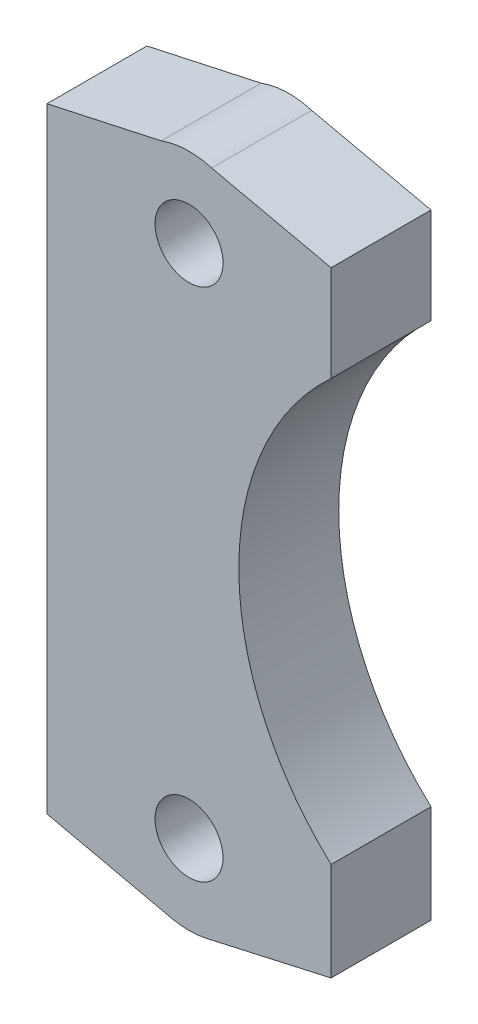
ISO-10303-21;
HEADER;
FILE_DESCRIPTION(('STEP AP214'),'2;1');
FILE_NAME('part.step','',(''),(''),'','','');
FILE_SCHEMA(('AUTOMOTIVE_DESIGN { 1 0 10303 214 1 1 1 1 }'));
ENDSEC;
DATA;
#1=APPLICATION_CONTEXT('core data for automotive mechanical design processes');
#2=APPLICATION_PROTOCOL_DEFINITION('international standard','automotive_design',2000,#1);
#3=PRODUCT_CONTEXT('',#1,'mechanical');
#4=PRODUCT('Part','Part','',(#3));
#5=PRODUCT_RELATED_PRODUCT_CATEGORY('part','',(#4));
#6=PRODUCT_DEFINITION_FORMATION('','',#4);
#7=PRODUCT_DEFINITION_CONTEXT('part definition',#1,'design');
#8=PRODUCT_DEFINITION('design','',#6,#7);
#9=PRODUCT_DEFINITION_SHAPE('','',#8);
#10=(LENGTH_UNIT() NAMED_UNIT(*) SI_UNIT(.MILLI.,.METRE.));
#11=(NAMED_UNIT(*) PLANE_ANGLE_UNIT() SI_UNIT($,.RADIAN.));
#12=(NAMED_UNIT(*) SI_UNIT($,.STERADIAN.) SOLID_ANGLE_UNIT());
#13=UNCERTAINTY_MEASURE_WITH_UNIT(LENGTH_MEASURE(1.E-05),#10,'distance_accuracy_value','');
#14=(GEOMETRIC_REPRESENTATION_CONTEXT(3) GLOBAL_UNCERTAINTY_ASSIGNED_CONTEXT((#13)) GLOBAL_UNIT_ASSIGNED_CONTEXT((#10,
#11,#12)) REPRESENTATION_CONTEXT('',''));
#15=CARTESIAN_POINT('',(0.,0.,0.));
#16=DIRECTION('',(0.,0.,1.));
#17=DIRECTION('',(1.,0.,0.));
#18=AXIS2_PLACEMENT_3D('',#15,#16,#17);
#19=CARTESIAN_POINT('',(27.6922594459164,-12.88997055683,5.0222745073035));
#20=DIRECTION('',(0.,0.,1.));
#21=DIRECTION('',(1.,0.,0.));
#22=AXIS2_PLACEMENT_3D('',#19,#20,#21);
#23=PLANE('',#22);
#24=CARTESIAN_POINT('',(27.6922594459164,-12.88997055683,5.0222745073035));
#25=DIRECTION('',(0.,0.,1.));
#26=DIRECTION('',(1.,0.,0.));
#27=AXIS2_PLACEMENT_3D('',#24,#25,#26);
#28=CIRCLE('',#27,1.7000000000002);
#29=CARTESIAN_POINT('',(29.3922594459166,-12.88997055683,5.0222745073035));
#30=VERTEX_POINT('',#29);
#31=EDGE_CURVE('E149',#30,#30,#28,.T.);
#32=ORIENTED_EDGE('',*,*,#31,.F.);
#33=EDGE_LOOP('',(#32));
#34=FACE_BOUND('',#33,.T.);
#35=CARTESIAN_POINT('',(27.6922594459164,-12.88997055683,5.0222745073035));
#36=DIRECTION('',(0.,0.,1.));
#37=DIRECTION('',(1.,0.,0.));
#38=AXIS2_PLACEMENT_3D('',#35,#36,#37);
#39=CIRCLE('',#38,3.99740349553943);
#40=CARTESIAN_POINT('',(26.8158530155752,-16.7901175380356,5.0222745073035));
#41=VERTEX_POINT('',#40);
#42=CARTESIAN_POINT('',(28.5686658762576,-16.7901175380356,5.0222745073035));
#43=VERTEX_POINT('',#42);
#44=EDGE_CURVE('E164',#41,#43,#39,.T.);
#45=ORIENTED_EDGE('',*,*,#44,.T.);
#46=DIRECTION('',(0.975670078228955,0.219243924542289,0.));
#47=VECTOR('',#46,1.);
#48=CARTESIAN_POINT('',(34.7995409964517,-15.3899705568307,5.0222745073035));
#49=LINE('',#48,#47);
#50=CARTESIAN_POINT('',(34.7995409964517,-15.3899705568307,5.0222745073035));
#51=VERTEX_POINT('',#50);
#52=EDGE_CURVE('E102',#43,#51,#49,.T.);
#53=ORIENTED_EDGE('',*,*,#52,.T.);
#54=DIRECTION('',(0.,1.,0.));
#55=VECTOR('',#54,1.);
#56=CARTESIAN_POINT('',(34.7995409964517,-15.3899705568307,5.0222745073035));
#57=LINE('',#56,#55);
#58=CARTESIAN_POINT('',(34.7995409964517,-10.4696394724291,5.0222745073035));
#59=VERTEX_POINT('',#58);
#60=EDGE_CURVE('E185',#51,#59,#57,.T.);
#61=ORIENTED_EDGE('',*,*,#60,.T.);
#62=CARTESIAN_POINT('',(44.4999999999989,0.0600294431714931,5.0222745073035));
#63=DIRECTION('',(0.,0.,-1.));
#64=DIRECTION('',(1.,0.,0.));
#65=AXIS2_PLACEMENT_3D('',#62,#63,#64);
#66=CIRCLE('',#65,14.3168722964084);
#67=CARTESIAN_POINT('',(34.7995409964517,10.5896983587721,5.0222745073035));
#68=VERTEX_POINT('',#67);
#69=EDGE_CURVE('E204',#59,#68,#66,.T.);
#70=ORIENTED_EDGE('',*,*,#69,.T.);
#71=DIRECTION('',(0.,1.,0.));
#72=VECTOR('',#71,1.);
#73=CARTESIAN_POINT('',(34.7995409964517,10.5896983587721,5.0222745073035));
#74=LINE('',#73,#72);
#75=CARTESIAN_POINT('',(34.7995409964517,15.3899705568256,5.0222745073035));
#76=VERTEX_POINT('',#75);
#77=EDGE_CURVE('E201',#68,#76,#74,.T.);
#78=ORIENTED_EDGE('',*,*,#77,.T.);
#79=DIRECTION('',(-0.975993027428264,0.217801768614059,0.));
#80=VECTOR('',#79,1.);
#81=CARTESIAN_POINT('',(34.7995409964517,15.3899705568256,5.0222745073035));
#82=LINE('',#81,#80);
#83=CARTESIAN_POINT('',(28.8288452214682,16.7223859154419,5.0222745073035));
#84=VERTEX_POINT('',#83);
#85=EDGE_CURVE('E203',#76,#84,#82,.T.);
#86=ORIENTED_EDGE('',*,*,#85,.T.);
#87=CARTESIAN_POINT('',(27.6922594459164,12.8899705568263,5.0222745073035));
#88=DIRECTION('',(0.,0.,1.));
#89=DIRECTION('',(1.,0.,0.));
#90=AXIS2_PLACEMENT_3D('',#87,#88,#89);
#91=CIRCLE('',#90,3.99740349553804);
#92=CARTESIAN_POINT('',(26.2984276536664,16.6364979677834,5.0222745073035));
#93=VERTEX_POINT('',#92);
#94=EDGE_CURVE('E127',#84,#93,#91,.T.);
#95=ORIENTED_EDGE('',*,*,#94,.T.);
#96=DIRECTION('',(-0.977017308665612,-0.213159983504887,0.));
#97=VECTOR('',#96,1.);
#98=CARTESIAN_POINT('',(20.584977895382,15.3899705568256,5.0222745073035));
#99=LINE('',#98,#97);
#100=CARTESIAN_POINT('',(20.584977895382,15.3899705568256,5.0222745073035));
#101=VERTEX_POINT('',#100);
#102=EDGE_CURVE('E121',#93,#101,#99,.T.);
#103=ORIENTED_EDGE('',*,*,#102,.T.);
#104=DIRECTION('',(0.,-1.,0.));
#105=VECTOR('',#104,1.);
#106=CARTESIAN_POINT('',(20.584977895382,-15.3899705568307,5.0222745073035));
#107=LINE('',#106,#105);
#108=CARTESIAN_POINT('',(20.584977895382,-15.3899705568307,5.0222745073035));
#109=VERTEX_POINT('',#108);
#110=EDGE_CURVE('E125',#101,#109,#107,.T.);
#111=ORIENTED_EDGE('',*,*,#110,.T.);
#112=DIRECTION('',(0.975670078228948,-0.219243924542318,0.));
#113=VECTOR('',#112,1.);
#114=CARTESIAN_POINT('',(26.8158530155752,-16.7901175380356,5.0222745073035));
#115=LINE('',#114,#113);
#116=EDGE_CURVE('E53',#109,#41,#115,.T.);
#117=ORIENTED_EDGE('',*,*,#116,.T.);
#118=EDGE_LOOP('',(#45,#53,#61,#70,#78,#86,#95,#103,#111,#117));
#119=FACE_BOUND('',#118,.T.);
#120=CARTESIAN_POINT('',(27.6922594459164,12.8899705568263,5.0222745073035));
#121=DIRECTION('',(0.,0.,1.));
#122=DIRECTION('',(1.,0.,0.));
#123=AXIS2_PLACEMENT_3D('',#120,#121,#122);
#124=CIRCLE('',#123,1.7000000000002);
#125=CARTESIAN_POINT('',(29.3922594459166,12.8899705568263,5.0222745073035));
#126=VERTEX_POINT('',#125);
#127=EDGE_CURVE('E215',#126,#126,#124,.T.);
#128=ORIENTED_EDGE('',*,*,#127,.F.);
#129=EDGE_LOOP('',(#128));
#130=FACE_BOUND('',#129,.T.);
#131=ADVANCED_FACE('F36',(#34,#119,#130),#23,.T.);
#132=CARTESIAN_POINT('',(27.6922594459164,-12.88997055683,0.0222745073034983));
#133=DIRECTION('',(0.,0.,1.));
#134=DIRECTION('',(1.,0.,0.));
#135=AXIS2_PLACEMENT_3D('',#132,#133,#134);
#136=PLANE('',#135);
#137=CARTESIAN_POINT('',(27.6922594459164,-12.88997055683,0.0222745073034983));
#138=DIRECTION('',(0.,0.,1.));
#139=DIRECTION('',(1.,0.,0.));
#140=AXIS2_PLACEMENT_3D('',#137,#138,#139);
#141=CIRCLE('',#140,3.99740349553943);
#142=CARTESIAN_POINT('',(26.8158530155752,-16.7901175380356,0.0222745073034983));
#143=VERTEX_POINT('',#142);
#144=CARTESIAN_POINT('',(28.5686658762576,-16.7901175380356,0.0222745073034983));
#145=VERTEX_POINT('',#144);
#146=EDGE_CURVE('E145',#143,#145,#141,.T.);
#147=ORIENTED_EDGE('',*,*,#146,.F.);
#148=DIRECTION('',(0.975670078228948,-0.219243924542318,0.));
#149=VECTOR('',#148,1.);
#150=CARTESIAN_POINT('',(26.8158530155752,-16.7901175380356,0.0222745073034983));
#151=LINE('',#150,#149);
#152=CARTESIAN_POINT('',(20.584977895382,-15.3899705568307,0.0222745073034983));
#153=VERTEX_POINT('',#152);
#154=EDGE_CURVE('E94',#153,#143,#151,.T.);
#155=ORIENTED_EDGE('',*,*,#154,.F.);
#156=DIRECTION('',(0.,-1.,0.));
#157=VECTOR('',#156,1.);
#158=CARTESIAN_POINT('',(20.584977895382,-15.3899705568307,0.0222745073034983));
#159=LINE('',#158,#157);
#160=CARTESIAN_POINT('',(20.584977895382,15.3899705568256,0.0222745073034983));
#161=VERTEX_POINT('',#160);
#162=EDGE_CURVE('E88',#161,#153,#159,.T.);
#163=ORIENTED_EDGE('',*,*,#162,.F.);
#164=DIRECTION('',(-0.977017308665612,-0.213159983504887,0.));
#165=VECTOR('',#164,1.);
#166=CARTESIAN_POINT('',(20.584977895382,15.3899705568256,0.0222745073034983));
#167=LINE('',#166,#165);
#168=CARTESIAN_POINT('',(26.2984276536664,16.6364979677834,0.0222745073034983));
#169=VERTEX_POINT('',#168);
#170=EDGE_CURVE('E135',#169,#161,#167,.T.);
#171=ORIENTED_EDGE('',*,*,#170,.F.);
#172=CARTESIAN_POINT('',(27.6922594459164,12.8899705568263,0.0222745073034983));
#173=DIRECTION('',(0.,0.,1.));
#174=DIRECTION('',(1.,0.,0.));
#175=AXIS2_PLACEMENT_3D('',#172,#173,#174);
#176=CIRCLE('',#175,3.99740349553804);
#177=CARTESIAN_POINT('',(28.8288452214682,16.7223859154419,0.0222745073034983));
#178=VERTEX_POINT('',#177);
#179=EDGE_CURVE('E159',#178,#169,#176,.T.);
#180=ORIENTED_EDGE('',*,*,#179,.F.);
#181=DIRECTION('',(-0.975993027428264,0.217801768614059,0.));
#182=VECTOR('',#181,1.);
#183=CARTESIAN_POINT('',(34.7995409964517,15.3899705568256,0.0222745073034983));
#184=LINE('',#183,#182);
#185=CARTESIAN_POINT('',(34.7995409964517,15.3899705568256,0.0222745073034983));
#186=VERTEX_POINT('',#185);
#187=EDGE_CURVE('E157',#186,#178,#184,.T.);
#188=ORIENTED_EDGE('',*,*,#187,.F.);
#189=DIRECTION('',(0.,1.,0.));
#190=VECTOR('',#189,1.);
#191=CARTESIAN_POINT('',(34.7995409964517,10.5896983587721,0.0222745073034983));
#192=LINE('',#191,#190);
#193=CARTESIAN_POINT('',(34.7995409964517,10.5896983587721,0.0222745073034983));
#194=VERTEX_POINT('',#193);
#195=EDGE_CURVE('E155',#194,#186,#192,.T.);
#196=ORIENTED_EDGE('',*,*,#195,.F.);
#197=CARTESIAN_POINT('',(44.4999999999989,0.0600294431714931,0.0222745073034983));
#198=DIRECTION('',(0.,0.,-1.));
#199=DIRECTION('',(1.,0.,0.));
#200=AXIS2_PLACEMENT_3D('',#197,#198,#199);
#201=CIRCLE('',#200,14.3168722964084);
#202=CARTESIAN_POINT('',(34.7995409964517,-10.4696394724291,0.0222745073034983));
#203=VERTEX_POINT('',#202);
#204=EDGE_CURVE('E153',#203,#194,#201,.T.);
#205=ORIENTED_EDGE('',*,*,#204,.F.);
#206=DIRECTION('',(0.,1.,0.));
#207=VECTOR('',#206,1.);
#208=CARTESIAN_POINT('',(34.7995409964517,-15.3899705568307,0.0222745073034983));
#209=LINE('',#208,#207);
#210=CARTESIAN_POINT('',(34.7995409964517,-15.3899705568307,0.0222745073034983));
#211=VERTEX_POINT('',#210);
#212=EDGE_CURVE('E151',#211,#203,#209,.T.);
#213=ORIENTED_EDGE('',*,*,#212,.F.);
#214=DIRECTION('',(0.975670078228955,0.219243924542289,0.));
#215=VECTOR('',#214,1.);
#216=CARTESIAN_POINT('',(34.7995409964517,-15.3899705568307,0.0222745073034983));
#217=LINE('',#216,#215);
#218=EDGE_CURVE('E148',#145,#211,#217,.T.);
#219=ORIENTED_EDGE('',*,*,#218,.F.);
#220=EDGE_LOOP('',(#147,#155,#163,#171,#180,#188,#196,#205,#213,#219));
#221=FACE_BOUND('',#220,.T.);
#222=CARTESIAN_POINT('',(27.6922594459164,-12.88997055683,0.0222745073034983));
#223=DIRECTION('',(0.,0.,1.));
#224=DIRECTION('',(1.,0.,0.));
#225=AXIS2_PLACEMENT_3D('',#222,#223,#224);
#226=CIRCLE('',#225,1.7000000000002);
#227=CARTESIAN_POINT('',(29.3922594459166,-12.88997055683,0.0222745073034983));
#228=VERTEX_POINT('',#227);
#229=EDGE_CURVE('E212',#228,#228,#226,.T.);
#230=ORIENTED_EDGE('',*,*,#229,.T.);
#231=EDGE_LOOP('',(#230));
#232=FACE_BOUND('',#231,.T.);
#233=CARTESIAN_POINT('',(27.6922594459164,12.8899705568263,0.0222745073034983));
#234=DIRECTION('',(0.,0.,1.));
#235=DIRECTION('',(1.,0.,0.));
#236=AXIS2_PLACEMENT_3D('',#233,#234,#235);
#237=CIRCLE('',#236,1.7000000000002);
#238=CARTESIAN_POINT('',(29.3922594459166,12.8899705568263,0.0222745073034983));
#239=VERTEX_POINT('',#238);
#240=EDGE_CURVE('E218',#239,#239,#237,.T.);
#241=ORIENTED_EDGE('',*,*,#240,.T.);
#242=EDGE_LOOP('',(#241));
#243=FACE_BOUND('',#242,.T.);
#244=ADVANCED_FACE('F189',(#221,#232,#243),#136,.F.);
#245=CARTESIAN_POINT('',(27.6922594459164,-12.88997055683,5.0222745073035));
#246=DIRECTION('',(0.,0.,-1.));
#247=DIRECTION('',(-1.,0.,0.));
#248=AXIS2_PLACEMENT_3D('',#245,#246,#247);
#249=CYLINDRICAL_SURFACE('',#248,3.99740349553943);
#250=ORIENTED_EDGE('',*,*,#146,.T.);
#251=DIRECTION('',(0.,0.,-1.));
#252=VECTOR('',#251,1.);
#253=CARTESIAN_POINT('',(28.5686658762576,-16.7901175380356,5.0222745073035));
#254=LINE('',#253,#252);
#255=EDGE_CURVE('E11',#43,#145,#254,.T.);
#256=ORIENTED_EDGE('',*,*,#255,.F.);
#257=ORIENTED_EDGE('',*,*,#44,.F.);
#258=DIRECTION('',(0.,0.,-1.));
#259=VECTOR('',#258,1.);
#260=CARTESIAN_POINT('',(26.8158530155752,-16.7901175380356,5.0222745073035));
#261=LINE('',#260,#259);
#262=EDGE_CURVE('E141',#41,#143,#261,.T.);
#263=ORIENTED_EDGE('',*,*,#262,.T.);
#264=EDGE_LOOP('',(#250,#256,#257,#263));
#265=FACE_BOUND('',#264,.T.);
#266=ADVANCED_FACE('F38',(#265),#249,.T.);
#267=CARTESIAN_POINT('',(34.7995409964517,-15.3899705568307,5.0222745073035));
#268=DIRECTION('',(-0.219243924542289,0.975670078228955,0.));
#269=DIRECTION('',(-0.975670078228955,-0.219243924542289,0.));
#270=AXIS2_PLACEMENT_3D('',#267,#268,#269);
#271=PLANE('',#270);
#272=ORIENTED_EDGE('',*,*,#218,.T.);
#273=DIRECTION('',(0.,0.,-1.));
#274=VECTOR('',#273,1.);
#275=CARTESIAN_POINT('',(34.7995409964517,-15.3899705568307,5.0222745073035));
#276=LINE('',#275,#274);
#277=EDGE_CURVE('E45',#51,#211,#276,.T.);
#278=ORIENTED_EDGE('',*,*,#277,.F.);
#279=ORIENTED_EDGE('',*,*,#52,.F.);
#280=ORIENTED_EDGE('',*,*,#255,.T.);
#281=EDGE_LOOP('',(#272,#278,#279,#280));
#282=FACE_BOUND('',#281,.T.);
#283=ADVANCED_FACE('F258',(#282),#271,.F.);
#284=CARTESIAN_POINT('',(34.7995409964517,-15.3899705568307,5.0222745073035));
#285=DIRECTION('',(-1.,0.,0.));
#286=DIRECTION('',(0.,-1.,0.));
#287=AXIS2_PLACEMENT_3D('',#284,#285,#286);
#288=PLANE('',#287);
#289=ORIENTED_EDGE('',*,*,#212,.T.);
#290=DIRECTION('',(0.,0.,-1.));
#291=VECTOR('',#290,1.);
#292=CARTESIAN_POINT('',(34.7995409964517,-10.4696394724291,5.0222745073035));
#293=LINE('',#292,#291);
#294=EDGE_CURVE('E177',#59,#203,#293,.T.);
#295=ORIENTED_EDGE('',*,*,#294,.F.);
#296=ORIENTED_EDGE('',*,*,#60,.F.);
#297=ORIENTED_EDGE('',*,*,#277,.T.);
#298=EDGE_LOOP('',(#289,#295,#296,#297));
#299=FACE_BOUND('',#298,.T.);
#300=ADVANCED_FACE('F183',(#299),#288,.F.);
#301=CARTESIAN_POINT('',(44.4999999999989,0.0600294431714931,5.0222745073035));
#302=DIRECTION('',(0.,0.,-1.));
#303=DIRECTION('',(-1.,0.,0.));
#304=AXIS2_PLACEMENT_3D('',#301,#302,#303);
#305=CYLINDRICAL_SURFACE('',#304,14.3168722964084);
#306=ORIENTED_EDGE('',*,*,#204,.T.);
#307=DIRECTION('',(0.,0.,-1.));
#308=VECTOR('',#307,1.);
#309=CARTESIAN_POINT('',(34.7995409964517,10.5896983587721,5.0222745073035));
#310=LINE('',#309,#308);
#311=EDGE_CURVE('E174',#68,#194,#310,.T.);
#312=ORIENTED_EDGE('',*,*,#311,.F.);
#313=ORIENTED_EDGE('',*,*,#69,.F.);
#314=ORIENTED_EDGE('',*,*,#294,.T.);
#315=EDGE_LOOP('',(#306,#312,#313,#314));
#316=FACE_BOUND('',#315,.T.);
#317=ADVANCED_FACE('F195',(#316),#305,.F.);
#318=CARTESIAN_POINT('',(34.7995409964517,10.5896983587721,5.0222745073035));
#319=DIRECTION('',(-1.,0.,0.));
#320=DIRECTION('',(0.,-1.,0.));
#321=AXIS2_PLACEMENT_3D('',#318,#319,#320);
#322=PLANE('',#321);
#323=ORIENTED_EDGE('',*,*,#195,.T.);
#324=DIRECTION('',(0.,0.,-1.));
#325=VECTOR('',#324,1.);
#326=CARTESIAN_POINT('',(34.7995409964517,15.3899705568256,5.0222745073035));
#327=LINE('',#326,#325);
#328=EDGE_CURVE('E171',#76,#186,#327,.T.);
#329=ORIENTED_EDGE('',*,*,#328,.F.);
#330=ORIENTED_EDGE('',*,*,#77,.F.);
#331=ORIENTED_EDGE('',*,*,#311,.T.);
#332=EDGE_LOOP('',(#323,#329,#330,#331));
#333=FACE_BOUND('',#332,.T.);
#334=ADVANCED_FACE('F199',(#333),#322,.F.);
#335=CARTESIAN_POINT('',(34.7995409964517,15.3899705568256,5.0222745073035));
#336=DIRECTION('',(-0.217801768614059,-0.975993027428264,0.));
#337=DIRECTION('',(0.975993027428264,-0.21780176861406,0.));
#338=AXIS2_PLACEMENT_3D('',#335,#336,#337);
#339=PLANE('',#338);
#340=ORIENTED_EDGE('',*,*,#187,.T.);
#341=DIRECTION('',(0.,0.,-1.));
#342=VECTOR('',#341,1.);
#343=CARTESIAN_POINT('',(28.8288452214682,16.7223859154419,5.0222745073035));
#344=LINE('',#343,#342);
#345=EDGE_CURVE('E168',#84,#178,#344,.T.);
#346=ORIENTED_EDGE('',*,*,#345,.F.);
#347=ORIENTED_EDGE('',*,*,#85,.F.);
#348=ORIENTED_EDGE('',*,*,#328,.T.);
#349=EDGE_LOOP('',(#340,#346,#347,#348));
#350=FACE_BOUND('',#349,.T.);
#351=ADVANCED_FACE('F248',(#350),#339,.F.);
#352=CARTESIAN_POINT('',(27.6922594459164,12.8899705568263,5.0222745073035));
#353=DIRECTION('',(0.,0.,-1.));
#354=DIRECTION('',(-1.,0.,0.));
#355=AXIS2_PLACEMENT_3D('',#352,#353,#354);
#356=CYLINDRICAL_SURFACE('',#355,3.99740349553804);
#357=ORIENTED_EDGE('',*,*,#179,.T.);
#358=DIRECTION('',(0.,0.,-1.));
#359=VECTOR('',#358,1.);
#360=CARTESIAN_POINT('',(26.2984276536664,16.6364979677834,5.0222745073035));
#361=LINE('',#360,#359);
#362=EDGE_CURVE('E136',#93,#169,#361,.T.);
#363=ORIENTED_EDGE('',*,*,#362,.F.);
#364=ORIENTED_EDGE('',*,*,#94,.F.);
#365=ORIENTED_EDGE('',*,*,#345,.T.);
#366=EDGE_LOOP('',(#357,#363,#364,#365));
#367=FACE_BOUND('',#366,.T.);
#368=ADVANCED_FACE('F245',(#367),#356,.T.);
#369=CARTESIAN_POINT('',(20.584977895382,15.3899705568256,5.0222745073035));
#370=DIRECTION('',(0.213159983504887,-0.977017308665612,0.));
#371=DIRECTION('',(0.977017308665613,0.213159983504887,0.));
#372=AXIS2_PLACEMENT_3D('',#369,#370,#371);
#373=PLANE('',#372);
#374=ORIENTED_EDGE('',*,*,#170,.T.);
#375=DIRECTION('',(0.,0.,-1.));
#376=VECTOR('',#375,1.);
#377=CARTESIAN_POINT('',(20.584977895382,15.3899705568256,5.0222745073035));
#378=LINE('',#377,#376);
#379=EDGE_CURVE('E132',#101,#161,#378,.T.);
#380=ORIENTED_EDGE('',*,*,#379,.F.);
#381=ORIENTED_EDGE('',*,*,#102,.F.);
#382=ORIENTED_EDGE('',*,*,#362,.T.);
#383=EDGE_LOOP('',(#374,#380,#381,#382));
#384=FACE_BOUND('',#383,.T.);
#385=ADVANCED_FACE('F133',(#384),#373,.F.);
#386=CARTESIAN_POINT('',(20.584977895382,-15.3899705568307,5.0222745073035));
#387=DIRECTION('',(1.,0.,0.));
#388=DIRECTION('',(0.,1.,0.));
#389=AXIS2_PLACEMENT_3D('',#386,#387,#388);
#390=PLANE('',#389);
#391=ORIENTED_EDGE('',*,*,#162,.T.);
#392=DIRECTION('',(0.,0.,-1.));
#393=VECTOR('',#392,1.);
#394=CARTESIAN_POINT('',(20.584977895382,-15.3899705568307,5.0222745073035));
#395=LINE('',#394,#393);
#396=EDGE_CURVE('E137',#109,#153,#395,.T.);
#397=ORIENTED_EDGE('',*,*,#396,.F.);
#398=ORIENTED_EDGE('',*,*,#110,.F.);
#399=ORIENTED_EDGE('',*,*,#379,.T.);
#400=EDGE_LOOP('',(#391,#397,#398,#399));
#401=FACE_BOUND('',#400,.T.);
#402=ADVANCED_FACE('F139',(#401),#390,.F.);
#403=CARTESIAN_POINT('',(26.8158530155752,-16.7901175380356,5.0222745073035));
#404=DIRECTION('',(0.219243924542318,0.975670078228948,0.));
#405=DIRECTION('',(-0.975670078228948,0.219243924542318,0.));
#406=AXIS2_PLACEMENT_3D('',#403,#404,#405);
#407=PLANE('',#406);
#408=ORIENTED_EDGE('',*,*,#154,.T.);
#409=ORIENTED_EDGE('',*,*,#262,.F.);
#410=ORIENTED_EDGE('',*,*,#116,.F.);
#411=ORIENTED_EDGE('',*,*,#396,.T.);
#412=EDGE_LOOP('',(#408,#409,#410,#411));
#413=FACE_BOUND('',#412,.T.);
#414=ADVANCED_FACE('F238',(#413),#407,.F.);
#415=CARTESIAN_POINT('',(27.6922594459164,-12.88997055683,5.0222745073035));
#416=DIRECTION('',(0.,0.,-1.));
#417=DIRECTION('',(-1.,0.,0.));
#418=AXIS2_PLACEMENT_3D('',#415,#416,#417);
#419=CYLINDRICAL_SURFACE('',#418,1.7000000000002);
#420=ORIENTED_EDGE('',*,*,#31,.T.);
#421=EDGE_LOOP('',(#420));
#422=FACE_BOUND('',#421,.T.);
#423=ORIENTED_EDGE('',*,*,#229,.F.);
#424=EDGE_LOOP('',(#423));
#425=FACE_BOUND('',#424,.T.);
#426=ADVANCED_FACE('F235',(#422,#425),#419,.F.);
#427=CARTESIAN_POINT('',(27.6922594459164,12.8899705568263,5.0222745073035));
#428=DIRECTION('',(0.,0.,-1.));
#429=DIRECTION('',(-1.,0.,0.));
#430=AXIS2_PLACEMENT_3D('',#427,#428,#429);
#431=CYLINDRICAL_SURFACE('',#430,1.7000000000002);
#432=ORIENTED_EDGE('',*,*,#127,.T.);
#433=EDGE_LOOP('',(#432));
#434=FACE_BOUND('',#433,.T.);
#435=ORIENTED_EDGE('',*,*,#240,.F.);
#436=EDGE_LOOP('',(#435));
#437=FACE_BOUND('',#436,.T.);
#438=ADVANCED_FACE('F224',(#434,#437),#431,.F.);
#439=CLOSED_SHELL('',(#131,#244,#266,#283,#300,#317,#334,#351,#368,#385,#402,#414,#426,#438));
#440=MANIFOLD_SOLID_BREP('B2',#439);
#441=ADVANCED_BREP_SHAPE_REPRESENTATION('',(#18,#440),#14);
#442=SHAPE_DEFINITION_REPRESENTATION(#9,#441);
ENDSEC;
END-ISO-10303-21;
